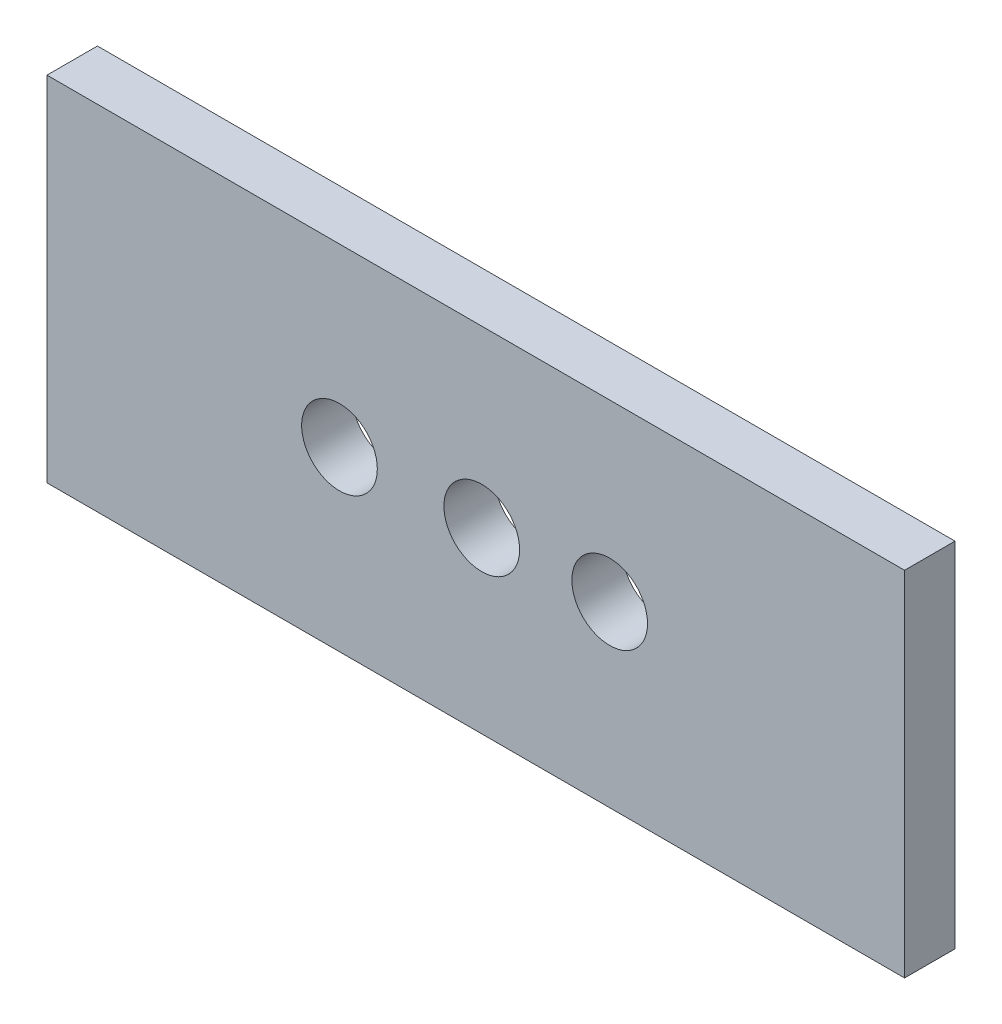
ISO-10303-21;
HEADER;
FILE_DESCRIPTION(('STEP AP214'),'2;1');
FILE_NAME('part.step','',(''),(''),'','','');
FILE_SCHEMA(('AUTOMOTIVE_DESIGN { 1 0 10303 214 1 1 1 1 }'));
ENDSEC;
DATA;
#1=APPLICATION_CONTEXT('core data for automotive mechanical design processes');
#2=APPLICATION_PROTOCOL_DEFINITION('international standard','automotive_design',2000,#1);
#3=PRODUCT_CONTEXT('',#1,'mechanical');
#4=PRODUCT('Part','Part','',(#3));
#5=PRODUCT_RELATED_PRODUCT_CATEGORY('part','',(#4));
#6=PRODUCT_DEFINITION_FORMATION('','',#4);
#7=PRODUCT_DEFINITION_CONTEXT('part definition',#1,'design');
#8=PRODUCT_DEFINITION('design','',#6,#7);
#9=PRODUCT_DEFINITION_SHAPE('','',#8);
#10=(LENGTH_UNIT() NAMED_UNIT(*) SI_UNIT(.MILLI.,.METRE.));
#11=(NAMED_UNIT(*) PLANE_ANGLE_UNIT() SI_UNIT($,.RADIAN.));
#12=(NAMED_UNIT(*) SI_UNIT($,.STERADIAN.) SOLID_ANGLE_UNIT());
#13=UNCERTAINTY_MEASURE_WITH_UNIT(LENGTH_MEASURE(1.E-05),#10,'distance_accuracy_value','');
#14=(GEOMETRIC_REPRESENTATION_CONTEXT(3) GLOBAL_UNCERTAINTY_ASSIGNED_CONTEXT((#13)) GLOBAL_UNIT_ASSIGNED_CONTEXT((#10,
#11,#12)) REPRESENTATION_CONTEXT('',''));
#15=CARTESIAN_POINT('',(0.,0.,0.));
#16=DIRECTION('',(0.,0.,1.));
#17=DIRECTION('',(1.,0.,0.));
#18=AXIS2_PLACEMENT_3D('',#15,#16,#17);
#19=CARTESIAN_POINT('',(-37.0557705075556,61.1735257214555,2.));
#20=DIRECTION('',(1.,0.,0.));
#21=DIRECTION('',(0.,0.,-1.));
#22=AXIS2_PLACEMENT_3D('',#19,#20,#21);
#23=PLANE('',#22);
#24=DIRECTION('',(0.,-1.,0.));
#25=VECTOR('',#24,1.);
#26=CARTESIAN_POINT('',(-37.0557705075556,61.1735257214555,0.));
#27=LINE('',#26,#25);
#28=CARTESIAN_POINT('',(-37.0557705075556,61.1735257214555,0.));
#29=VERTEX_POINT('',#28);
#30=CARTESIAN_POINT('',(-37.0557705075556,47.1735257214555,0.));
#31=VERTEX_POINT('',#30);
#32=EDGE_CURVE('E104',#29,#31,#27,.T.);
#33=ORIENTED_EDGE('',*,*,#32,.T.);
#34=DIRECTION('',(0.,0.,-1.));
#35=VECTOR('',#34,1.);
#36=CARTESIAN_POINT('',(-37.0557705075556,47.1735257214555,2.));
#37=LINE('',#36,#35);
#38=CARTESIAN_POINT('',(-37.0557705075556,47.1735257214555,2.));
#39=VERTEX_POINT('',#38);
#40=EDGE_CURVE('E11',#39,#31,#37,.T.);
#41=ORIENTED_EDGE('',*,*,#40,.F.);
#42=DIRECTION('',(0.,-1.,0.));
#43=VECTOR('',#42,1.);
#44=CARTESIAN_POINT('',(-37.0557705075556,61.1735257214555,2.));
#45=LINE('',#44,#43);
#46=CARTESIAN_POINT('',(-37.0557705075556,61.1735257214555,2.));
#47=VERTEX_POINT('',#46);
#48=EDGE_CURVE('E90',#47,#39,#45,.T.);
#49=ORIENTED_EDGE('',*,*,#48,.F.);
#50=DIRECTION('',(0.,0.,-1.));
#51=VECTOR('',#50,1.);
#52=CARTESIAN_POINT('',(-37.0557705075556,61.1735257214555,2.));
#53=LINE('',#52,#51);
#54=EDGE_CURVE('E57',#47,#29,#53,.T.);
#55=ORIENTED_EDGE('',*,*,#54,.T.);
#56=EDGE_LOOP('',(#33,#41,#49,#55));
#57=FACE_BOUND('',#56,.T.);
#58=ADVANCED_FACE('F41',(#57),#23,.F.);
#59=CARTESIAN_POINT('',(-37.0557705075556,47.1735257214555,2.));
#60=DIRECTION('',(0.,1.,0.));
#61=DIRECTION('',(0.,0.,1.));
#62=AXIS2_PLACEMENT_3D('',#59,#60,#61);
#63=PLANE('',#62);
#64=DIRECTION('',(1.,0.,0.));
#65=VECTOR('',#64,1.);
#66=CARTESIAN_POINT('',(-37.0557705075556,47.1735257214555,0.));
#67=LINE('',#66,#65);
#68=CARTESIAN_POINT('',(-3.05577050755556,47.1735257214555,0.));
#69=VERTEX_POINT('',#68);
#70=EDGE_CURVE('E95',#31,#69,#67,.T.);
#71=ORIENTED_EDGE('',*,*,#70,.T.);
#72=DIRECTION('',(0.,0.,-1.));
#73=VECTOR('',#72,1.);
#74=CARTESIAN_POINT('',(-3.05577050755556,47.1735257214555,2.));
#75=LINE('',#74,#73);
#76=CARTESIAN_POINT('',(-3.05577050755556,47.1735257214555,2.));
#77=VERTEX_POINT('',#76);
#78=EDGE_CURVE('E49',#77,#69,#75,.T.);
#79=ORIENTED_EDGE('',*,*,#78,.F.);
#80=DIRECTION('',(1.,0.,0.));
#81=VECTOR('',#80,1.);
#82=CARTESIAN_POINT('',(-37.0557705075556,47.1735257214555,2.));
#83=LINE('',#82,#81);
#84=EDGE_CURVE('E82',#39,#77,#83,.T.);
#85=ORIENTED_EDGE('',*,*,#84,.F.);
#86=ORIENTED_EDGE('',*,*,#40,.T.);
#87=EDGE_LOOP('',(#71,#79,#85,#86));
#88=FACE_BOUND('',#87,.T.);
#89=ADVANCED_FACE('F94',(#88),#63,.F.);
#90=CARTESIAN_POINT('',(-3.05577050755556,61.1735257214555,2.));
#91=DIRECTION('',(1.,0.,0.));
#92=DIRECTION('',(0.,0.,-1.));
#93=AXIS2_PLACEMENT_3D('',#90,#91,#92);
#94=PLANE('',#93);
#95=DIRECTION('',(0.,-1.,0.));
#96=VECTOR('',#95,1.);
#97=CARTESIAN_POINT('',(-3.05577050755556,61.1735257214555,0.));
#98=LINE('',#97,#96);
#99=CARTESIAN_POINT('',(-3.05577050755556,61.1735257214555,0.));
#100=VERTEX_POINT('',#99);
#101=EDGE_CURVE('E108',#100,#69,#98,.T.);
#102=ORIENTED_EDGE('',*,*,#101,.F.);
#103=DIRECTION('',(0.,0.,-1.));
#104=VECTOR('',#103,1.);
#105=CARTESIAN_POINT('',(-3.05577050755556,61.1735257214555,2.));
#106=LINE('',#105,#104);
#107=CARTESIAN_POINT('',(-3.05577050755556,61.1735257214555,2.));
#108=VERTEX_POINT('',#107);
#109=EDGE_CURVE('E71',#108,#100,#106,.T.);
#110=ORIENTED_EDGE('',*,*,#109,.F.);
#111=DIRECTION('',(0.,-1.,0.));
#112=VECTOR('',#111,1.);
#113=CARTESIAN_POINT('',(-3.05577050755556,61.1735257214555,2.));
#114=LINE('',#113,#112);
#115=EDGE_CURVE('E89',#108,#77,#114,.T.);
#116=ORIENTED_EDGE('',*,*,#115,.T.);
#117=ORIENTED_EDGE('',*,*,#78,.T.);
#118=EDGE_LOOP('',(#102,#110,#116,#117));
#119=FACE_BOUND('',#118,.T.);
#120=ADVANCED_FACE('F98',(#119),#94,.T.);
#121=CARTESIAN_POINT('',(-37.0557705075556,61.1735257214555,2.));
#122=DIRECTION('',(0.,1.,0.));
#123=DIRECTION('',(0.,0.,1.));
#124=AXIS2_PLACEMENT_3D('',#121,#122,#123);
#125=PLANE('',#124);
#126=DIRECTION('',(1.,0.,0.));
#127=VECTOR('',#126,1.);
#128=CARTESIAN_POINT('',(-37.0557705075556,61.1735257214555,0.));
#129=LINE('',#128,#127);
#130=EDGE_CURVE('E110',#29,#100,#129,.T.);
#131=ORIENTED_EDGE('',*,*,#130,.F.);
#132=ORIENTED_EDGE('',*,*,#54,.F.);
#133=DIRECTION('',(1.,0.,0.));
#134=VECTOR('',#133,1.);
#135=CARTESIAN_POINT('',(-37.0557705075556,61.1735257214555,2.));
#136=LINE('',#135,#134);
#137=EDGE_CURVE('E99',#47,#108,#136,.T.);
#138=ORIENTED_EDGE('',*,*,#137,.T.);
#139=ORIENTED_EDGE('',*,*,#109,.T.);
#140=EDGE_LOOP('',(#131,#132,#138,#139));
#141=FACE_BOUND('',#140,.T.);
#142=ADVANCED_FACE('F146',(#141),#125,.T.);
#143=CARTESIAN_POINT('',(0.,0.,2.));
#144=DIRECTION('',(0.,0.,1.));
#145=DIRECTION('',(1.,0.,0.));
#146=AXIS2_PLACEMENT_3D('',#143,#144,#145);
#147=PLANE('',#146);
#148=CARTESIAN_POINT('',(-19.8187706469673,54.244625679632,2.));
#149=DIRECTION('',(0.,0.,1.));
#150=DIRECTION('',(1.,0.,0.));
#151=AXIS2_PLACEMENT_3D('',#148,#149,#150);
#152=CIRCLE('',#151,1.5);
#153=CARTESIAN_POINT('',(-18.3187706469673,54.244625679632,2.));
#154=VERTEX_POINT('',#153);
#155=EDGE_CURVE('E128',#154,#154,#152,.T.);
#156=ORIENTED_EDGE('',*,*,#155,.F.);
#157=EDGE_LOOP('',(#156));
#158=FACE_BOUND('',#157,.T.);
#159=CARTESIAN_POINT('',(-14.7469736303773,54.244625679632,2.));
#160=DIRECTION('',(0.,0.,1.));
#161=DIRECTION('',(1.,0.,0.));
#162=AXIS2_PLACEMENT_3D('',#159,#160,#161);
#163=CIRCLE('',#162,1.5);
#164=CARTESIAN_POINT('',(-13.2469736303773,54.244625679632,2.));
#165=VERTEX_POINT('',#164);
#166=EDGE_CURVE('E125',#165,#165,#163,.T.);
#167=ORIENTED_EDGE('',*,*,#166,.F.);
#168=EDGE_LOOP('',(#167));
#169=FACE_BOUND('',#168,.T.);
#170=CARTESIAN_POINT('',(-25.4593673289692,54.1972257075143,2.));
#171=DIRECTION('',(0.,0.,1.));
#172=DIRECTION('',(1.,0.,0.));
#173=AXIS2_PLACEMENT_3D('',#170,#171,#172);
#174=CIRCLE('',#173,1.5);
#175=CARTESIAN_POINT('',(-23.9593673289692,54.1972257075143,2.));
#176=VERTEX_POINT('',#175);
#177=EDGE_CURVE('E116',#176,#176,#174,.T.);
#178=ORIENTED_EDGE('',*,*,#177,.F.);
#179=EDGE_LOOP('',(#178));
#180=FACE_BOUND('',#179,.T.);
#181=ORIENTED_EDGE('',*,*,#48,.T.);
#182=ORIENTED_EDGE('',*,*,#84,.T.);
#183=ORIENTED_EDGE('',*,*,#115,.F.);
#184=ORIENTED_EDGE('',*,*,#137,.F.);
#185=EDGE_LOOP('',(#181,#182,#183,#184));
#186=FACE_BOUND('',#185,.T.);
#187=ADVANCED_FACE('F86',(#158,#169,#180,#186),#147,.T.);
#188=CARTESIAN_POINT('',(0.,0.,0.));
#189=DIRECTION('',(0.,0.,1.));
#190=DIRECTION('',(1.,0.,0.));
#191=AXIS2_PLACEMENT_3D('',#188,#189,#190);
#192=PLANE('',#191);
#193=CARTESIAN_POINT('',(-19.8187706469673,54.244625679632,0.));
#194=DIRECTION('',(0.,0.,1.));
#195=DIRECTION('',(1.,0.,0.));
#196=AXIS2_PLACEMENT_3D('',#193,#194,#195);
#197=CIRCLE('',#196,1.5);
#198=CARTESIAN_POINT('',(-18.3187706469673,54.244625679632,0.));
#199=VERTEX_POINT('',#198);
#200=EDGE_CURVE('E119',#199,#199,#197,.T.);
#201=ORIENTED_EDGE('',*,*,#200,.T.);
#202=EDGE_LOOP('',(#201));
#203=FACE_BOUND('',#202,.T.);
#204=CARTESIAN_POINT('',(-14.7469736303773,54.244625679632,0.));
#205=DIRECTION('',(0.,0.,1.));
#206=DIRECTION('',(1.,0.,0.));
#207=AXIS2_PLACEMENT_3D('',#204,#205,#206);
#208=CIRCLE('',#207,1.5);
#209=CARTESIAN_POINT('',(-13.2469736303773,54.244625679632,0.));
#210=VERTEX_POINT('',#209);
#211=EDGE_CURVE('E122',#210,#210,#208,.T.);
#212=ORIENTED_EDGE('',*,*,#211,.T.);
#213=EDGE_LOOP('',(#212));
#214=FACE_BOUND('',#213,.T.);
#215=CARTESIAN_POINT('',(-25.4593673289692,54.1972257075143,0.));
#216=DIRECTION('',(0.,0.,1.));
#217=DIRECTION('',(1.,0.,0.));
#218=AXIS2_PLACEMENT_3D('',#215,#216,#217);
#219=CIRCLE('',#218,1.5);
#220=CARTESIAN_POINT('',(-23.9593673289692,54.1972257075143,0.));
#221=VERTEX_POINT('',#220);
#222=EDGE_CURVE('E106',#221,#221,#219,.T.);
#223=ORIENTED_EDGE('',*,*,#222,.T.);
#224=EDGE_LOOP('',(#223));
#225=FACE_BOUND('',#224,.T.);
#226=ORIENTED_EDGE('',*,*,#32,.F.);
#227=ORIENTED_EDGE('',*,*,#130,.T.);
#228=ORIENTED_EDGE('',*,*,#101,.T.);
#229=ORIENTED_EDGE('',*,*,#70,.F.);
#230=EDGE_LOOP('',(#226,#227,#228,#229));
#231=FACE_BOUND('',#230,.T.);
#232=ADVANCED_FACE('F134',(#203,#214,#225,#231),#192,.F.);
#233=CARTESIAN_POINT('',(-25.4593673289692,54.1972257075143,0.));
#234=DIRECTION('',(0.,0.,1.));
#235=DIRECTION('',(1.,0.,0.));
#236=AXIS2_PLACEMENT_3D('',#233,#234,#235);
#237=CYLINDRICAL_SURFACE('',#236,1.5);
#238=ORIENTED_EDGE('',*,*,#222,.F.);
#239=EDGE_LOOP('',(#238));
#240=FACE_BOUND('',#239,.T.);
#241=ORIENTED_EDGE('',*,*,#177,.T.);
#242=EDGE_LOOP('',(#241));
#243=FACE_BOUND('',#242,.T.);
#244=ADVANCED_FACE('F152',(#240,#243),#237,.F.);
#245=CARTESIAN_POINT('',(-14.7469736303773,54.244625679632,0.));
#246=DIRECTION('',(0.,0.,1.));
#247=DIRECTION('',(1.,0.,0.));
#248=AXIS2_PLACEMENT_3D('',#245,#246,#247);
#249=CYLINDRICAL_SURFACE('',#248,1.5);
#250=ORIENTED_EDGE('',*,*,#211,.F.);
#251=EDGE_LOOP('',(#250));
#252=FACE_BOUND('',#251,.T.);
#253=ORIENTED_EDGE('',*,*,#166,.T.);
#254=EDGE_LOOP('',(#253));
#255=FACE_BOUND('',#254,.T.);
#256=ADVANCED_FACE('F140',(#252,#255),#249,.F.);
#257=CARTESIAN_POINT('',(-19.8187706469673,54.244625679632,0.));
#258=DIRECTION('',(0.,0.,1.));
#259=DIRECTION('',(1.,0.,0.));
#260=AXIS2_PLACEMENT_3D('',#257,#258,#259);
#261=CYLINDRICAL_SURFACE('',#260,1.5);
#262=ORIENTED_EDGE('',*,*,#200,.F.);
#263=EDGE_LOOP('',(#262));
#264=FACE_BOUND('',#263,.T.);
#265=ORIENTED_EDGE('',*,*,#155,.T.);
#266=EDGE_LOOP('',(#265));
#267=FACE_BOUND('',#266,.T.);
#268=ADVANCED_FACE('F137',(#264,#267),#261,.F.);
#269=CLOSED_SHELL('',(#58,#89,#120,#142,#187,#232,#244,#256,#268));
#270=MANIFOLD_SOLID_BREP('B2',#269);
#271=ADVANCED_BREP_SHAPE_REPRESENTATION('',(#18,#270),#14);
#272=SHAPE_DEFINITION_REPRESENTATION(#9,#271);
ENDSEC;
END-ISO-10303-21;
